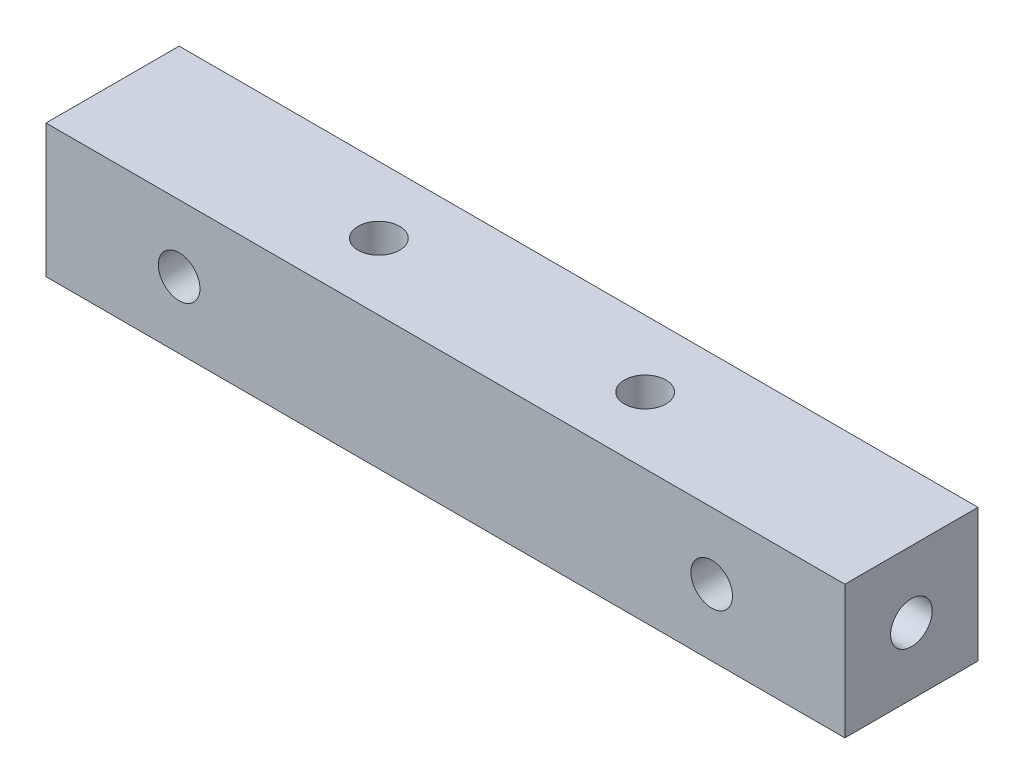
ISO-10303-21;
HEADER;
FILE_DESCRIPTION(('STEP AP214'),'2;1');
FILE_NAME('part.step','',(''),(''),'','','');
FILE_SCHEMA(('AUTOMOTIVE_DESIGN { 1 0 10303 214 1 1 1 1 }'));
ENDSEC;
DATA;
#1=APPLICATION_CONTEXT('core data for automotive mechanical design processes');
#2=APPLICATION_PROTOCOL_DEFINITION('international standard','automotive_design',2000,#1);
#3=PRODUCT_CONTEXT('',#1,'mechanical');
#4=PRODUCT('Part','Part','',(#3));
#5=PRODUCT_RELATED_PRODUCT_CATEGORY('part','',(#4));
#6=PRODUCT_DEFINITION_FORMATION('','',#4);
#7=PRODUCT_DEFINITION_CONTEXT('part definition',#1,'design');
#8=PRODUCT_DEFINITION('design','',#6,#7);
#9=PRODUCT_DEFINITION_SHAPE('','',#8);
#10=(LENGTH_UNIT() NAMED_UNIT(*) SI_UNIT(.MILLI.,.METRE.));
#11=(NAMED_UNIT(*) PLANE_ANGLE_UNIT() SI_UNIT($,.RADIAN.));
#12=(NAMED_UNIT(*) SI_UNIT($,.STERADIAN.) SOLID_ANGLE_UNIT());
#13=UNCERTAINTY_MEASURE_WITH_UNIT(LENGTH_MEASURE(1.E-05),#10,'distance_accuracy_value','');
#14=(GEOMETRIC_REPRESENTATION_CONTEXT(3) GLOBAL_UNCERTAINTY_ASSIGNED_CONTEXT((#13)) GLOBAL_UNIT_ASSIGNED_CONTEXT((#10,
#11,#12)) REPRESENTATION_CONTEXT('',''));
#15=CARTESIAN_POINT('',(0.,0.,0.));
#16=DIRECTION('',(0.,0.,1.));
#17=DIRECTION('',(1.,0.,0.));
#18=AXIS2_PLACEMENT_3D('',#15,#16,#17);
#19=CARTESIAN_POINT('',(16.,0.,8.));
#20=DIRECTION('',(0.,0.,1.));
#21=DIRECTION('',(1.,0.,0.));
#22=AXIS2_PLACEMENT_3D('',#19,#20,#21);
#23=CYLINDRICAL_SURFACE('',#22,1.25);
#24=CARTESIAN_POINT('',(16.,0.,8.));
#25=DIRECTION('',(0.,0.,1.));
#26=DIRECTION('',(1.,0.,0.));
#27=AXIS2_PLACEMENT_3D('',#24,#25,#26);
#28=CIRCLE('',#27,1.25);
#29=CARTESIAN_POINT('',(17.25,0.,8.));
#30=VERTEX_POINT('',#29);
#31=EDGE_CURVE('E141',#30,#30,#28,.T.);
#32=ORIENTED_EDGE('',*,*,#31,.T.);
#33=EDGE_LOOP('',(#32));
#34=FACE_BOUND('',#33,.T.);
#35=CARTESIAN_POINT('',(16.,0.,4.));
#36=DIRECTION('',(0.707106781186547,0.,0.707106781186547));
#37=DIRECTION('',(-0.707106781186547,0.,0.707106781186547));
#38=AXIS2_PLACEMENT_3D('',#35,#36,#37);
#39=ELLIPSE('',#38,1.76776695296636,1.24999999999999);
#40=CARTESIAN_POINT('',(16.,-1.24999999999999,4.));
#41=VERTEX_POINT('',#40);
#42=CARTESIAN_POINT('',(16.,1.24999999999999,4.));
#43=VERTEX_POINT('',#42);
#44=EDGE_CURVE('E57',#41,#43,#39,.F.);
#45=ORIENTED_EDGE('',*,*,#44,.T.);
#46=CARTESIAN_POINT('',(16.,0.,4.));
#47=DIRECTION('',(-0.707106781186547,0.,0.707106781186547));
#48=DIRECTION('',(0.707106781186547,0.,0.707106781186547));
#49=AXIS2_PLACEMENT_3D('',#46,#47,#48);
#50=ELLIPSE('',#49,1.76776695296636,1.24999999999999);
#51=EDGE_CURVE('E185',#43,#41,#50,.F.);
#52=ORIENTED_EDGE('',*,*,#51,.T.);
#53=EDGE_LOOP('',(#45,#52));
#54=FACE_BOUND('',#53,.T.);
#55=ADVANCED_FACE('F43',(#34,#54),#23,.F.);
#56=CARTESIAN_POINT('',(-16.,0.,8.));
#57=DIRECTION('',(0.,0.,1.));
#58=DIRECTION('',(1.,0.,0.));
#59=AXIS2_PLACEMENT_3D('',#56,#57,#58);
#60=CYLINDRICAL_SURFACE('',#59,1.25);
#61=CARTESIAN_POINT('',(-16.,0.,8.));
#62=DIRECTION('',(0.,0.,1.));
#63=DIRECTION('',(1.,0.,0.));
#64=AXIS2_PLACEMENT_3D('',#61,#62,#63);
#65=CIRCLE('',#64,1.25);
#66=CARTESIAN_POINT('',(-14.75,0.,8.));
#67=VERTEX_POINT('',#66);
#68=EDGE_CURVE('E137',#67,#67,#65,.T.);
#69=ORIENTED_EDGE('',*,*,#68,.T.);
#70=EDGE_LOOP('',(#69));
#71=FACE_BOUND('',#70,.T.);
#72=CARTESIAN_POINT('',(-16.,0.,4.));
#73=DIRECTION('',(0.707106781186547,0.,0.707106781186547));
#74=DIRECTION('',(-0.707106781186547,0.,0.707106781186547));
#75=AXIS2_PLACEMENT_3D('',#72,#73,#74);
#76=ELLIPSE('',#75,1.76776695296636,1.24999999999999);
#77=CARTESIAN_POINT('',(-16.,-1.24999999999999,4.));
#78=VERTEX_POINT('',#77);
#79=CARTESIAN_POINT('',(-16.,1.24999999999999,4.));
#80=VERTEX_POINT('',#79);
#81=EDGE_CURVE('E64',#78,#80,#76,.F.);
#82=ORIENTED_EDGE('',*,*,#81,.T.);
#83=CARTESIAN_POINT('',(-16.,0.,4.));
#84=DIRECTION('',(-0.707106781186547,0.,0.707106781186547));
#85=DIRECTION('',(0.707106781186547,0.,0.707106781186547));
#86=AXIS2_PLACEMENT_3D('',#83,#84,#85);
#87=ELLIPSE('',#86,1.76776695296636,1.24999999999999);
#88=EDGE_CURVE('E194',#80,#78,#87,.F.);
#89=ORIENTED_EDGE('',*,*,#88,.T.);
#90=EDGE_LOOP('',(#82,#89));
#91=FACE_BOUND('',#90,.T.);
#92=ADVANCED_FACE('F255',(#71,#91),#60,.F.);
#93=CARTESIAN_POINT('',(8.,4.,4.));
#94=DIRECTION('',(0.,1.,0.));
#95=DIRECTION('',(0.,0.,1.));
#96=AXIS2_PLACEMENT_3D('',#93,#94,#95);
#97=CYLINDRICAL_SURFACE('',#96,1.25);
#98=CARTESIAN_POINT('',(8.,4.,4.));
#99=DIRECTION('',(0.,1.,0.));
#100=DIRECTION('',(0.,0.,1.));
#101=AXIS2_PLACEMENT_3D('',#98,#99,#100);
#102=CIRCLE('',#101,1.25);
#103=CARTESIAN_POINT('',(8.,4.,5.25));
#104=VERTEX_POINT('',#103);
#105=EDGE_CURVE('E132',#104,#104,#102,.T.);
#106=ORIENTED_EDGE('',*,*,#105,.T.);
#107=EDGE_LOOP('',(#106));
#108=FACE_BOUND('',#107,.T.);
#109=CARTESIAN_POINT('',(8.,0.,4.));
#110=DIRECTION('',(0.707106781186547,0.707106781186547,0.));
#111=DIRECTION('',(-0.707106781186547,0.707106781186547,0.));
#112=AXIS2_PLACEMENT_3D('',#109,#110,#111);
#113=ELLIPSE('',#112,1.76776695296636,1.24999999999999);
#114=CARTESIAN_POINT('',(8.,0.,5.24999999999999));
#115=VERTEX_POINT('',#114);
#116=CARTESIAN_POINT('',(8.,0.,2.75000000000001));
#117=VERTEX_POINT('',#116);
#118=EDGE_CURVE('E212',#115,#117,#113,.F.);
#119=ORIENTED_EDGE('',*,*,#118,.T.);
#120=CARTESIAN_POINT('',(8.,0.,4.));
#121=DIRECTION('',(-0.707106781186547,0.707106781186547,0.));
#122=DIRECTION('',(0.707106781186547,0.707106781186547,0.));
#123=AXIS2_PLACEMENT_3D('',#120,#121,#122);
#124=ELLIPSE('',#123,1.76776695296636,1.24999999999999);
#125=EDGE_CURVE('E203',#117,#115,#124,.F.);
#126=ORIENTED_EDGE('',*,*,#125,.T.);
#127=EDGE_LOOP('',(#119,#126));
#128=FACE_BOUND('',#127,.T.);
#129=ADVANCED_FACE('F263',(#108,#128),#97,.F.);
#130=CARTESIAN_POINT('',(-8.,4.,4.));
#131=DIRECTION('',(0.,1.,0.));
#132=DIRECTION('',(0.,0.,1.));
#133=AXIS2_PLACEMENT_3D('',#130,#131,#132);
#134=CYLINDRICAL_SURFACE('',#133,1.25);
#135=CARTESIAN_POINT('',(-8.,4.,4.));
#136=DIRECTION('',(0.,1.,0.));
#137=DIRECTION('',(0.,0.,1.));
#138=AXIS2_PLACEMENT_3D('',#135,#136,#137);
#139=CIRCLE('',#138,1.25);
#140=CARTESIAN_POINT('',(-8.,4.,5.25));
#141=VERTEX_POINT('',#140);
#142=EDGE_CURVE('E133',#141,#141,#139,.T.);
#143=ORIENTED_EDGE('',*,*,#142,.T.);
#144=EDGE_LOOP('',(#143));
#145=FACE_BOUND('',#144,.T.);
#146=CARTESIAN_POINT('',(-8.,0.,4.));
#147=DIRECTION('',(0.707106781186547,0.707106781186547,0.));
#148=DIRECTION('',(-0.707106781186547,0.707106781186547,0.));
#149=AXIS2_PLACEMENT_3D('',#146,#147,#148);
#150=ELLIPSE('',#149,1.76776695296636,1.24999999999999);
#151=CARTESIAN_POINT('',(-8.,0.,5.24999999999999));
#152=VERTEX_POINT('',#151);
#153=CARTESIAN_POINT('',(-8.,0.,2.75000000000001));
#154=VERTEX_POINT('',#153);
#155=EDGE_CURVE('E116',#152,#154,#150,.F.);
#156=ORIENTED_EDGE('',*,*,#155,.T.);
#157=CARTESIAN_POINT('',(-8.,0.,4.));
#158=DIRECTION('',(-0.707106781186547,0.707106781186547,0.));
#159=DIRECTION('',(0.707106781186547,0.707106781186547,0.));
#160=AXIS2_PLACEMENT_3D('',#157,#158,#159);
#161=ELLIPSE('',#160,1.76776695296636,1.24999999999999);
#162=EDGE_CURVE('E11',#154,#152,#161,.F.);
#163=ORIENTED_EDGE('',*,*,#162,.T.);
#164=EDGE_LOOP('',(#156,#163));
#165=FACE_BOUND('',#164,.T.);
#166=ADVANCED_FACE('F125',(#145,#165),#134,.F.);
#167=CARTESIAN_POINT('',(24.,4.,8.));
#168=DIRECTION('',(-1.,0.,0.));
#169=DIRECTION('',(0.,0.,1.));
#170=AXIS2_PLACEMENT_3D('',#167,#168,#169);
#171=PLANE('',#170);
#172=CARTESIAN_POINT('',(24.,0.,4.));
#173=DIRECTION('',(-1.,0.,0.));
#174=DIRECTION('',(0.,0.,1.));
#175=AXIS2_PLACEMENT_3D('',#172,#173,#174);
#176=CIRCLE('',#175,1.24999999999999);
#177=CARTESIAN_POINT('',(24.,0.,5.24999999999999));
#178=VERTEX_POINT('',#177);
#179=EDGE_CURVE('E182',#178,#178,#176,.T.);
#180=ORIENTED_EDGE('',*,*,#179,.T.);
#181=EDGE_LOOP('',(#180));
#182=FACE_BOUND('',#181,.T.);
#183=DIRECTION('',(0.,1.,0.));
#184=VECTOR('',#183,1.);
#185=CARTESIAN_POINT('',(24.,4.,0.));
#186=LINE('',#185,#184);
#187=CARTESIAN_POINT('',(24.,-4.,0.));
#188=VERTEX_POINT('',#187);
#189=CARTESIAN_POINT('',(24.,4.,0.));
#190=VERTEX_POINT('',#189);
#191=EDGE_CURVE('E145',#188,#190,#186,.T.);
#192=ORIENTED_EDGE('',*,*,#191,.T.);
#193=DIRECTION('',(0.,0.,-1.));
#194=VECTOR('',#193,1.);
#195=CARTESIAN_POINT('',(24.,4.,8.));
#196=LINE('',#195,#194);
#197=CARTESIAN_POINT('',(24.,4.,8.));
#198=VERTEX_POINT('',#197);
#199=EDGE_CURVE('E123',#198,#190,#196,.T.);
#200=ORIENTED_EDGE('',*,*,#199,.F.);
#201=DIRECTION('',(0.,1.,0.));
#202=VECTOR('',#201,1.);
#203=CARTESIAN_POINT('',(24.,4.,8.));
#204=LINE('',#203,#202);
#205=CARTESIAN_POINT('',(24.,-4.,8.));
#206=VERTEX_POINT('',#205);
#207=EDGE_CURVE('E160',#206,#198,#204,.T.);
#208=ORIENTED_EDGE('',*,*,#207,.F.);
#209=DIRECTION('',(0.,0.,-1.));
#210=VECTOR('',#209,1.);
#211=CARTESIAN_POINT('',(24.,-4.,8.));
#212=LINE('',#211,#210);
#213=EDGE_CURVE('E154',#206,#188,#212,.T.);
#214=ORIENTED_EDGE('',*,*,#213,.T.);
#215=EDGE_LOOP('',(#192,#200,#208,#214));
#216=FACE_BOUND('',#215,.T.);
#217=ADVANCED_FACE('F45',(#182,#216),#171,.F.);
#218=CARTESIAN_POINT('',(-24.,4.,8.));
#219=DIRECTION('',(0.,-1.,0.));
#220=DIRECTION('',(1.,0.,0.));
#221=AXIS2_PLACEMENT_3D('',#218,#219,#220);
#222=PLANE('',#221);
#223=ORIENTED_EDGE('',*,*,#142,.F.);
#224=EDGE_LOOP('',(#223));
#225=FACE_BOUND('',#224,.T.);
#226=ORIENTED_EDGE('',*,*,#105,.F.);
#227=EDGE_LOOP('',(#226));
#228=FACE_BOUND('',#227,.T.);
#229=DIRECTION('',(-1.,0.,0.));
#230=VECTOR('',#229,1.);
#231=CARTESIAN_POINT('',(-24.,4.,0.));
#232=LINE('',#231,#230);
#233=CARTESIAN_POINT('',(-24.,4.,0.));
#234=VERTEX_POINT('',#233);
#235=EDGE_CURVE('E163',#190,#234,#232,.T.);
#236=ORIENTED_EDGE('',*,*,#235,.T.);
#237=DIRECTION('',(0.,0.,-1.));
#238=VECTOR('',#237,1.);
#239=CARTESIAN_POINT('',(-24.,4.,8.));
#240=LINE('',#239,#238);
#241=CARTESIAN_POINT('',(-24.,4.,8.));
#242=VERTEX_POINT('',#241);
#243=EDGE_CURVE('E148',#242,#234,#240,.T.);
#244=ORIENTED_EDGE('',*,*,#243,.F.);
#245=DIRECTION('',(-1.,0.,0.));
#246=VECTOR('',#245,1.);
#247=CARTESIAN_POINT('',(-24.,4.,8.));
#248=LINE('',#247,#246);
#249=EDGE_CURVE('E170',#198,#242,#248,.T.);
#250=ORIENTED_EDGE('',*,*,#249,.F.);
#251=ORIENTED_EDGE('',*,*,#199,.T.);
#252=EDGE_LOOP('',(#236,#244,#250,#251));
#253=FACE_BOUND('',#252,.T.);
#254=ADVANCED_FACE('F225',(#225,#228,#253),#222,.F.);
#255=CARTESIAN_POINT('',(-24.,4.,8.));
#256=DIRECTION('',(1.,0.,0.));
#257=DIRECTION('',(0.,0.,-1.));
#258=AXIS2_PLACEMENT_3D('',#255,#256,#257);
#259=PLANE('',#258);
#260=CARTESIAN_POINT('',(-24.,0.,4.));
#261=DIRECTION('',(-1.,0.,0.));
#262=DIRECTION('',(0.,0.,1.));
#263=AXIS2_PLACEMENT_3D('',#260,#261,#262);
#264=CIRCLE('',#263,1.24999999999999);
#265=CARTESIAN_POINT('',(-24.,0.,5.24999999999999));
#266=VERTEX_POINT('',#265);
#267=EDGE_CURVE('E214',#266,#266,#264,.T.);
#268=ORIENTED_EDGE('',*,*,#267,.F.);
#269=EDGE_LOOP('',(#268));
#270=FACE_BOUND('',#269,.T.);
#271=DIRECTION('',(0.,-1.,0.));
#272=VECTOR('',#271,1.);
#273=CARTESIAN_POINT('',(-24.,4.,0.));
#274=LINE('',#273,#272);
#275=CARTESIAN_POINT('',(-24.,-4.,0.));
#276=VERTEX_POINT('',#275);
#277=EDGE_CURVE('E161',#234,#276,#274,.T.);
#278=ORIENTED_EDGE('',*,*,#277,.T.);
#279=DIRECTION('',(0.,0.,-1.));
#280=VECTOR('',#279,1.);
#281=CARTESIAN_POINT('',(-24.,-4.,8.));
#282=LINE('',#281,#280);
#283=CARTESIAN_POINT('',(-24.,-4.,8.));
#284=VERTEX_POINT('',#283);
#285=EDGE_CURVE('E151',#284,#276,#282,.T.);
#286=ORIENTED_EDGE('',*,*,#285,.F.);
#287=DIRECTION('',(0.,-1.,0.));
#288=VECTOR('',#287,1.);
#289=CARTESIAN_POINT('',(-24.,4.,8.));
#290=LINE('',#289,#288);
#291=EDGE_CURVE('E168',#242,#284,#290,.T.);
#292=ORIENTED_EDGE('',*,*,#291,.F.);
#293=ORIENTED_EDGE('',*,*,#243,.T.);
#294=EDGE_LOOP('',(#278,#286,#292,#293));
#295=FACE_BOUND('',#294,.T.);
#296=ADVANCED_FACE('F221',(#270,#295),#259,.F.);
#297=CARTESIAN_POINT('',(-24.,-4.,8.));
#298=DIRECTION('',(0.,1.,0.));
#299=DIRECTION('',(0.,0.,1.));
#300=AXIS2_PLACEMENT_3D('',#297,#298,#299);
#301=PLANE('',#300);
#302=CARTESIAN_POINT('',(-8.,-4.,4.));
#303=DIRECTION('',(0.,1.,0.));
#304=DIRECTION('',(0.,0.,1.));
#305=AXIS2_PLACEMENT_3D('',#302,#303,#304);
#306=CIRCLE('',#305,1.25);
#307=CARTESIAN_POINT('',(-8.,-4.,5.25));
#308=VERTEX_POINT('',#307);
#309=EDGE_CURVE('E129',#308,#308,#306,.T.);
#310=ORIENTED_EDGE('',*,*,#309,.T.);
#311=EDGE_LOOP('',(#310));
#312=FACE_BOUND('',#311,.T.);
#313=CARTESIAN_POINT('',(8.,-4.,4.));
#314=DIRECTION('',(0.,1.,0.));
#315=DIRECTION('',(0.,0.,1.));
#316=AXIS2_PLACEMENT_3D('',#313,#314,#315);
#317=CIRCLE('',#316,1.25);
#318=CARTESIAN_POINT('',(8.,-4.,5.25));
#319=VERTEX_POINT('',#318);
#320=EDGE_CURVE('E134',#319,#319,#317,.T.);
#321=ORIENTED_EDGE('',*,*,#320,.T.);
#322=EDGE_LOOP('',(#321));
#323=FACE_BOUND('',#322,.T.);
#324=DIRECTION('',(1.,0.,0.));
#325=VECTOR('',#324,1.);
#326=CARTESIAN_POINT('',(-24.,-4.,0.));
#327=LINE('',#326,#325);
#328=EDGE_CURVE('E158',#276,#188,#327,.T.);
#329=ORIENTED_EDGE('',*,*,#328,.T.);
#330=ORIENTED_EDGE('',*,*,#213,.F.);
#331=DIRECTION('',(1.,0.,0.));
#332=VECTOR('',#331,1.);
#333=CARTESIAN_POINT('',(-24.,-4.,8.));
#334=LINE('',#333,#332);
#335=EDGE_CURVE('E157',#284,#206,#334,.T.);
#336=ORIENTED_EDGE('',*,*,#335,.F.);
#337=ORIENTED_EDGE('',*,*,#285,.T.);
#338=EDGE_LOOP('',(#329,#330,#336,#337));
#339=FACE_BOUND('',#338,.T.);
#340=ADVANCED_FACE('F224',(#312,#323,#339),#301,.F.);
#341=CARTESIAN_POINT('',(0.,0.,8.));
#342=DIRECTION('',(0.,0.,1.));
#343=DIRECTION('',(1.,0.,0.));
#344=AXIS2_PLACEMENT_3D('',#341,#342,#343);
#345=PLANE('',#344);
#346=ORIENTED_EDGE('',*,*,#68,.F.);
#347=EDGE_LOOP('',(#346));
#348=FACE_BOUND('',#347,.T.);
#349=ORIENTED_EDGE('',*,*,#31,.F.);
#350=EDGE_LOOP('',(#349));
#351=FACE_BOUND('',#350,.T.);
#352=ORIENTED_EDGE('',*,*,#207,.T.);
#353=ORIENTED_EDGE('',*,*,#249,.T.);
#354=ORIENTED_EDGE('',*,*,#291,.T.);
#355=ORIENTED_EDGE('',*,*,#335,.T.);
#356=EDGE_LOOP('',(#352,#353,#354,#355));
#357=FACE_BOUND('',#356,.T.);
#358=ADVANCED_FACE('F242',(#348,#351,#357),#345,.T.);
#359=CARTESIAN_POINT('',(0.,0.,0.));
#360=DIRECTION('',(0.,0.,1.));
#361=DIRECTION('',(1.,0.,0.));
#362=AXIS2_PLACEMENT_3D('',#359,#360,#361);
#363=PLANE('',#362);
#364=CARTESIAN_POINT('',(-16.,0.,0.));
#365=DIRECTION('',(0.,0.,1.));
#366=DIRECTION('',(1.,0.,0.));
#367=AXIS2_PLACEMENT_3D('',#364,#365,#366);
#368=CIRCLE('',#367,1.25);
#369=CARTESIAN_POINT('',(-14.75,0.,0.));
#370=VERTEX_POINT('',#369);
#371=EDGE_CURVE('E138',#370,#370,#368,.T.);
#372=ORIENTED_EDGE('',*,*,#371,.T.);
#373=EDGE_LOOP('',(#372));
#374=FACE_BOUND('',#373,.T.);
#375=CARTESIAN_POINT('',(16.,0.,0.));
#376=DIRECTION('',(0.,0.,1.));
#377=DIRECTION('',(1.,0.,0.));
#378=AXIS2_PLACEMENT_3D('',#375,#376,#377);
#379=CIRCLE('',#378,1.25);
#380=CARTESIAN_POINT('',(17.25,0.,0.));
#381=VERTEX_POINT('',#380);
#382=EDGE_CURVE('E142',#381,#381,#379,.T.);
#383=ORIENTED_EDGE('',*,*,#382,.T.);
#384=EDGE_LOOP('',(#383));
#385=FACE_BOUND('',#384,.T.);
#386=ORIENTED_EDGE('',*,*,#191,.F.);
#387=ORIENTED_EDGE('',*,*,#328,.F.);
#388=ORIENTED_EDGE('',*,*,#277,.F.);
#389=ORIENTED_EDGE('',*,*,#235,.F.);
#390=EDGE_LOOP('',(#386,#387,#388,#389));
#391=FACE_BOUND('',#390,.T.);
#392=ADVANCED_FACE('F237',(#374,#385,#391),#363,.F.);
#393=CARTESIAN_POINT('',(16.,0.,4.));
#394=DIRECTION('',(0.707106781186547,0.,0.707106781186547));
#395=DIRECTION('',(-0.707106781186547,0.,0.707106781186547));
#396=AXIS2_PLACEMENT_3D('',#393,#394,#395);
#397=ELLIPSE('',#396,1.76776695296636,1.24999999999999);
#398=EDGE_CURVE('E190',#41,#43,#397,.T.);
#399=ORIENTED_EDGE('',*,*,#398,.T.);
#400=CARTESIAN_POINT('',(16.,0.,4.));
#401=DIRECTION('',(-0.707106781186547,0.,0.707106781186547));
#402=DIRECTION('',(0.707106781186547,0.,0.707106781186547));
#403=AXIS2_PLACEMENT_3D('',#400,#401,#402);
#404=ELLIPSE('',#403,1.76776695296636,1.24999999999999);
#405=EDGE_CURVE('E187',#43,#41,#404,.T.);
#406=ORIENTED_EDGE('',*,*,#405,.T.);
#407=EDGE_LOOP('',(#399,#406));
#408=FACE_BOUND('',#407,.T.);
#409=ORIENTED_EDGE('',*,*,#382,.F.);
#410=EDGE_LOOP('',(#409));
#411=FACE_BOUND('',#410,.T.);
#412=ADVANCED_FACE('F258',(#408,#411),#23,.F.);
#413=CARTESIAN_POINT('',(-16.,0.,4.));
#414=DIRECTION('',(0.707106781186547,0.,0.707106781186547));
#415=DIRECTION('',(-0.707106781186547,0.,0.707106781186547));
#416=AXIS2_PLACEMENT_3D('',#413,#414,#415);
#417=ELLIPSE('',#416,1.76776695296636,1.24999999999999);
#418=EDGE_CURVE('E199',#78,#80,#417,.T.);
#419=ORIENTED_EDGE('',*,*,#418,.T.);
#420=CARTESIAN_POINT('',(-16.,0.,4.));
#421=DIRECTION('',(-0.707106781186547,0.,0.707106781186547));
#422=DIRECTION('',(0.707106781186547,0.,0.707106781186547));
#423=AXIS2_PLACEMENT_3D('',#420,#421,#422);
#424=ELLIPSE('',#423,1.76776695296636,1.24999999999999);
#425=EDGE_CURVE('E196',#80,#78,#424,.T.);
#426=ORIENTED_EDGE('',*,*,#425,.T.);
#427=EDGE_LOOP('',(#419,#426));
#428=FACE_BOUND('',#427,.T.);
#429=ORIENTED_EDGE('',*,*,#371,.F.);
#430=EDGE_LOOP('',(#429));
#431=FACE_BOUND('',#430,.T.);
#432=ADVANCED_FACE('F266',(#428,#431),#60,.F.);
#433=CARTESIAN_POINT('',(8.,0.,4.));
#434=DIRECTION('',(0.707106781186547,0.707106781186547,0.));
#435=DIRECTION('',(-0.707106781186547,0.707106781186547,0.));
#436=AXIS2_PLACEMENT_3D('',#433,#434,#435);
#437=ELLIPSE('',#436,1.76776695296636,1.24999999999999);
#438=EDGE_CURVE('E209',#115,#117,#437,.T.);
#439=ORIENTED_EDGE('',*,*,#438,.T.);
#440=CARTESIAN_POINT('',(8.,0.,4.));
#441=DIRECTION('',(-0.707106781186547,0.707106781186547,0.));
#442=DIRECTION('',(0.707106781186547,0.707106781186547,0.));
#443=AXIS2_PLACEMENT_3D('',#440,#441,#442);
#444=ELLIPSE('',#443,1.76776695296636,1.24999999999999);
#445=EDGE_CURVE('E206',#117,#115,#444,.T.);
#446=ORIENTED_EDGE('',*,*,#445,.T.);
#447=EDGE_LOOP('',(#439,#446));
#448=FACE_BOUND('',#447,.T.);
#449=ORIENTED_EDGE('',*,*,#320,.F.);
#450=EDGE_LOOP('',(#449));
#451=FACE_BOUND('',#450,.T.);
#452=ADVANCED_FACE('F274',(#448,#451),#97,.F.);
#453=CARTESIAN_POINT('',(-8.,0.,4.));
#454=DIRECTION('',(0.707106781186547,0.707106781186547,0.));
#455=DIRECTION('',(-0.707106781186547,0.707106781186547,0.));
#456=AXIS2_PLACEMENT_3D('',#453,#454,#455);
#457=ELLIPSE('',#456,1.76776695296636,1.24999999999999);
#458=EDGE_CURVE('E110',#152,#154,#457,.T.);
#459=ORIENTED_EDGE('',*,*,#458,.T.);
#460=CARTESIAN_POINT('',(-8.,0.,4.));
#461=DIRECTION('',(-0.707106781186547,0.707106781186547,0.));
#462=DIRECTION('',(0.707106781186547,0.707106781186547,0.));
#463=AXIS2_PLACEMENT_3D('',#460,#461,#462);
#464=ELLIPSE('',#463,1.76776695296636,1.24999999999999);
#465=EDGE_CURVE('E51',#154,#152,#464,.T.);
#466=ORIENTED_EDGE('',*,*,#465,.T.);
#467=EDGE_LOOP('',(#459,#466));
#468=FACE_BOUND('',#467,.T.);
#469=ORIENTED_EDGE('',*,*,#309,.F.);
#470=EDGE_LOOP('',(#469));
#471=FACE_BOUND('',#470,.T.);
#472=ADVANCED_FACE('F126',(#468,#471),#134,.F.);
#473=CARTESIAN_POINT('',(-24.,0.,4.));
#474=DIRECTION('',(-1.,0.,0.));
#475=DIRECTION('',(0.,0.,1.));
#476=AXIS2_PLACEMENT_3D('',#473,#474,#475);
#477=CYLINDRICAL_SURFACE('',#476,1.24999999999999);
#478=ORIENTED_EDGE('',*,*,#155,.F.);
#479=ORIENTED_EDGE('',*,*,#465,.F.);
#480=EDGE_LOOP('',(#478,#479));
#481=FACE_BOUND('',#480,.T.);
#482=ORIENTED_EDGE('',*,*,#418,.F.);
#483=ORIENTED_EDGE('',*,*,#88,.F.);
#484=EDGE_LOOP('',(#482,#483));
#485=FACE_BOUND('',#484,.T.);
#486=ADVANCED_FACE('F120',(#481,#485),#477,.F.);
#487=ORIENTED_EDGE('',*,*,#458,.F.);
#488=ORIENTED_EDGE('',*,*,#162,.F.);
#489=EDGE_LOOP('',(#487,#488));
#490=FACE_BOUND('',#489,.T.);
#491=ORIENTED_EDGE('',*,*,#118,.F.);
#492=ORIENTED_EDGE('',*,*,#445,.F.);
#493=EDGE_LOOP('',(#491,#492));
#494=FACE_BOUND('',#493,.T.);
#495=ADVANCED_FACE('F112',(#490,#494),#477,.F.);
#496=ORIENTED_EDGE('',*,*,#438,.F.);
#497=ORIENTED_EDGE('',*,*,#125,.F.);
#498=EDGE_LOOP('',(#496,#497));
#499=FACE_BOUND('',#498,.T.);
#500=ORIENTED_EDGE('',*,*,#44,.F.);
#501=ORIENTED_EDGE('',*,*,#405,.F.);
#502=EDGE_LOOP('',(#500,#501));
#503=FACE_BOUND('',#502,.T.);
#504=ADVANCED_FACE('F286',(#499,#503),#477,.F.);
#505=ORIENTED_EDGE('',*,*,#267,.T.);
#506=EDGE_LOOP('',(#505));
#507=FACE_BOUND('',#506,.T.);
#508=ORIENTED_EDGE('',*,*,#81,.F.);
#509=ORIENTED_EDGE('',*,*,#425,.F.);
#510=EDGE_LOOP('',(#508,#509));
#511=FACE_BOUND('',#510,.T.);
#512=ADVANCED_FACE('F218',(#507,#511),#477,.F.);
#513=ORIENTED_EDGE('',*,*,#398,.F.);
#514=ORIENTED_EDGE('',*,*,#51,.F.);
#515=EDGE_LOOP('',(#513,#514));
#516=FACE_BOUND('',#515,.T.);
#517=ORIENTED_EDGE('',*,*,#179,.F.);
#518=EDGE_LOOP('',(#517));
#519=FACE_BOUND('',#518,.T.);
#520=ADVANCED_FACE('F283',(#516,#519),#477,.F.);
#521=CLOSED_SHELL('',(#55,#92,#129,#166,#217,#254,#296,#340,#358,#392,#412,#432,#452,#472,#486,
#495,#504,#512,#520));
#522=MANIFOLD_SOLID_BREP('B2',#521);
#523=ADVANCED_BREP_SHAPE_REPRESENTATION('',(#18,#522),#14);
#524=SHAPE_DEFINITION_REPRESENTATION(#9,#523);
ENDSEC;
END-ISO-10303-21;
